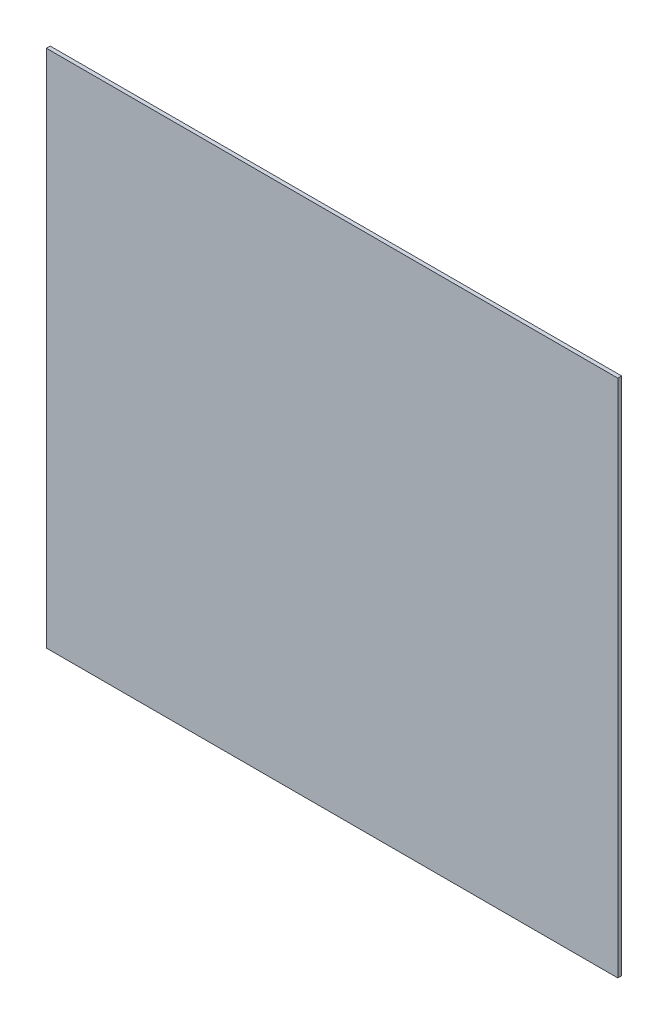
ISO-10303-21;
HEADER;
FILE_DESCRIPTION(('STEP AP214'),'2;1');
FILE_NAME('part.step','',(''),(''),'','','');
FILE_SCHEMA(('AUTOMOTIVE_DESIGN { 1 0 10303 214 1 1 1 1 }'));
ENDSEC;
DATA;
#1=APPLICATION_CONTEXT('core data for automotive mechanical design processes');
#2=APPLICATION_PROTOCOL_DEFINITION('international standard','automotive_design',2000,#1);
#3=PRODUCT_CONTEXT('',#1,'mechanical');
#4=PRODUCT('Part','Part','',(#3));
#5=PRODUCT_RELATED_PRODUCT_CATEGORY('part','',(#4));
#6=PRODUCT_DEFINITION_FORMATION('','',#4);
#7=PRODUCT_DEFINITION_CONTEXT('part definition',#1,'design');
#8=PRODUCT_DEFINITION('design','',#6,#7);
#9=PRODUCT_DEFINITION_SHAPE('','',#8);
#10=(LENGTH_UNIT() NAMED_UNIT(*) SI_UNIT(.MILLI.,.METRE.));
#11=(NAMED_UNIT(*) PLANE_ANGLE_UNIT() SI_UNIT($,.RADIAN.));
#12=(NAMED_UNIT(*) SI_UNIT($,.STERADIAN.) SOLID_ANGLE_UNIT());
#13=UNCERTAINTY_MEASURE_WITH_UNIT(LENGTH_MEASURE(1.E-05),#10,'distance_accuracy_value','');
#14=(GEOMETRIC_REPRESENTATION_CONTEXT(3) GLOBAL_UNCERTAINTY_ASSIGNED_CONTEXT((#13)) GLOBAL_UNIT_ASSIGNED_CONTEXT((#10,
#11,#12)) REPRESENTATION_CONTEXT('',''));
#15=CARTESIAN_POINT('',(0.,0.,0.));
#16=DIRECTION('',(0.,0.,1.));
#17=DIRECTION('',(1.,0.,0.));
#18=AXIS2_PLACEMENT_3D('',#15,#16,#17);
#19=CARTESIAN_POINT('',(0.,4.99999999999999,0.07366));
#20=DIRECTION('',(1.,0.,0.));
#21=DIRECTION('',(0.,1.,0.));
#22=AXIS2_PLACEMENT_3D('',#19,#20,#21);
#23=PLANE('',#22);
#24=DIRECTION('',(0.,-1.,0.));
#25=VECTOR('',#24,1.);
#26=CARTESIAN_POINT('',(0.,4.99999999999999,0.));
#27=LINE('',#26,#25);
#28=CARTESIAN_POINT('',(0.,4.99999999999999,0.));
#29=VERTEX_POINT('',#28);
#30=CARTESIAN_POINT('',(0.,-5.00000000000001,0.));
#31=VERTEX_POINT('',#30);
#32=EDGE_CURVE('E113',#29,#31,#27,.T.);
#33=ORIENTED_EDGE('',*,*,#32,.T.);
#34=DIRECTION('',(0.,0.,-1.));
#35=VECTOR('',#34,1.);
#36=CARTESIAN_POINT('',(0.,-5.00000000000001,0.07366));
#37=LINE('',#36,#35);
#38=CARTESIAN_POINT('',(0.,-5.00000000000001,0.07366));
#39=VERTEX_POINT('',#38);
#40=EDGE_CURVE('E11',#39,#31,#37,.T.);
#41=ORIENTED_EDGE('',*,*,#40,.F.);
#42=DIRECTION('',(0.,-1.,0.));
#43=VECTOR('',#42,1.);
#44=CARTESIAN_POINT('',(0.,4.99999999999999,0.07366));
#45=LINE('',#44,#43);
#46=CARTESIAN_POINT('',(0.,4.99999999999999,0.07366));
#47=VERTEX_POINT('',#46);
#48=EDGE_CURVE('E97',#47,#39,#45,.T.);
#49=ORIENTED_EDGE('',*,*,#48,.F.);
#50=DIRECTION('',(0.,0.,-1.));
#51=VECTOR('',#50,1.);
#52=CARTESIAN_POINT('',(0.,4.99999999999999,0.07366));
#53=LINE('',#52,#51);
#54=EDGE_CURVE('E109',#47,#29,#53,.T.);
#55=ORIENTED_EDGE('',*,*,#54,.T.);
#56=EDGE_LOOP('',(#33,#41,#49,#55));
#57=FACE_BOUND('',#56,.T.);
#58=ADVANCED_FACE('F45',(#57),#23,.F.);
#59=CARTESIAN_POINT('',(0.,-5.00000000000001,0.07366));
#60=DIRECTION('',(0.,1.,0.));
#61=DIRECTION('',(-1.,0.,0.));
#62=AXIS2_PLACEMENT_3D('',#59,#60,#61);
#63=PLANE('',#62);
#64=DIRECTION('',(1.,0.,0.));
#65=VECTOR('',#64,1.);
#66=CARTESIAN_POINT('',(0.,-5.00000000000001,0.));
#67=LINE('',#66,#65);
#68=CARTESIAN_POINT('',(11.,-4.99999999999999,0.));
#69=VERTEX_POINT('',#68);
#70=EDGE_CURVE('E102',#31,#69,#67,.T.);
#71=ORIENTED_EDGE('',*,*,#70,.T.);
#72=DIRECTION('',(0.,0.,-1.));
#73=VECTOR('',#72,1.);
#74=CARTESIAN_POINT('',(11.,-4.99999999999999,0.07366));
#75=LINE('',#74,#73);
#76=CARTESIAN_POINT('',(11.,-4.99999999999999,0.07366));
#77=VERTEX_POINT('',#76);
#78=EDGE_CURVE('E54',#77,#69,#75,.T.);
#79=ORIENTED_EDGE('',*,*,#78,.F.);
#80=DIRECTION('',(1.,0.,0.));
#81=VECTOR('',#80,1.);
#82=CARTESIAN_POINT('',(0.,-5.00000000000001,0.07366));
#83=LINE('',#82,#81);
#84=EDGE_CURVE('E92',#39,#77,#83,.T.);
#85=ORIENTED_EDGE('',*,*,#84,.F.);
#86=ORIENTED_EDGE('',*,*,#40,.T.);
#87=EDGE_LOOP('',(#71,#79,#85,#86));
#88=FACE_BOUND('',#87,.T.);
#89=ADVANCED_FACE('F101',(#88),#63,.F.);
#90=CARTESIAN_POINT('',(11.,5.,0.07366));
#91=DIRECTION('',(-1.,0.,0.));
#92=DIRECTION('',(0.,-1.,0.));
#93=AXIS2_PLACEMENT_3D('',#90,#91,#92);
#94=PLANE('',#93);
#95=DIRECTION('',(0.,1.,0.));
#96=VECTOR('',#95,1.);
#97=CARTESIAN_POINT('',(11.,5.,0.));
#98=LINE('',#97,#96);
#99=CARTESIAN_POINT('',(11.,5.,0.));
#100=VERTEX_POINT('',#99);
#101=EDGE_CURVE('E79',#69,#100,#98,.T.);
#102=ORIENTED_EDGE('',*,*,#101,.T.);
#103=DIRECTION('',(0.,0.,-1.));
#104=VECTOR('',#103,1.);
#105=CARTESIAN_POINT('',(11.,5.,0.07366));
#106=LINE('',#105,#104);
#107=CARTESIAN_POINT('',(11.,5.,0.07366));
#108=VERTEX_POINT('',#107);
#109=EDGE_CURVE('E104',#108,#100,#106,.T.);
#110=ORIENTED_EDGE('',*,*,#109,.F.);
#111=DIRECTION('',(0.,1.,0.));
#112=VECTOR('',#111,1.);
#113=CARTESIAN_POINT('',(11.,5.,0.07366));
#114=LINE('',#113,#112);
#115=EDGE_CURVE('E95',#77,#108,#114,.T.);
#116=ORIENTED_EDGE('',*,*,#115,.F.);
#117=ORIENTED_EDGE('',*,*,#78,.T.);
#118=EDGE_LOOP('',(#102,#110,#116,#117));
#119=FACE_BOUND('',#118,.T.);
#120=ADVANCED_FACE('F105',(#119),#94,.F.);
#121=CARTESIAN_POINT('',(0.,4.99999999999999,0.07366));
#122=DIRECTION('',(0.,-1.,0.));
#123=DIRECTION('',(1.,0.,0.));
#124=AXIS2_PLACEMENT_3D('',#121,#122,#123);
#125=PLANE('',#124);
#126=DIRECTION('',(-1.,0.,0.));
#127=VECTOR('',#126,1.);
#128=CARTESIAN_POINT('',(0.,4.99999999999999,0.));
#129=LINE('',#128,#127);
#130=EDGE_CURVE('E85',#100,#29,#129,.T.);
#131=ORIENTED_EDGE('',*,*,#130,.T.);
#132=ORIENTED_EDGE('',*,*,#54,.F.);
#133=DIRECTION('',(-1.,0.,0.));
#134=VECTOR('',#133,1.);
#135=CARTESIAN_POINT('',(0.,4.99999999999999,0.07366));
#136=LINE('',#135,#134);
#137=EDGE_CURVE('E62',#108,#47,#136,.T.);
#138=ORIENTED_EDGE('',*,*,#137,.F.);
#139=ORIENTED_EDGE('',*,*,#109,.T.);
#140=EDGE_LOOP('',(#131,#132,#138,#139));
#141=FACE_BOUND('',#140,.T.);
#142=ADVANCED_FACE('F126',(#141),#125,.F.);
#143=CARTESIAN_POINT('',(0.,0.,0.07366));
#144=DIRECTION('',(0.,0.,1.));
#145=DIRECTION('',(1.,0.,0.));
#146=AXIS2_PLACEMENT_3D('',#143,#144,#145);
#147=PLANE('',#146);
#148=ORIENTED_EDGE('',*,*,#48,.T.);
#149=ORIENTED_EDGE('',*,*,#84,.T.);
#150=ORIENTED_EDGE('',*,*,#115,.T.);
#151=ORIENTED_EDGE('',*,*,#137,.T.);
#152=EDGE_LOOP('',(#148,#149,#150,#151));
#153=FACE_BOUND('',#152,.T.);
#154=ADVANCED_FACE('F93',(#153),#147,.T.);
#155=CARTESIAN_POINT('',(0.,0.,0.));
#156=DIRECTION('',(0.,0.,1.));
#157=DIRECTION('',(1.,0.,0.));
#158=AXIS2_PLACEMENT_3D('',#155,#156,#157);
#159=PLANE('',#158);
#160=ORIENTED_EDGE('',*,*,#32,.F.);
#161=ORIENTED_EDGE('',*,*,#130,.F.);
#162=ORIENTED_EDGE('',*,*,#101,.F.);
#163=ORIENTED_EDGE('',*,*,#70,.F.);
#164=EDGE_LOOP('',(#160,#161,#162,#163));
#165=FACE_BOUND('',#164,.T.);
#166=ADVANCED_FACE('F129',(#165),#159,.F.);
#167=CLOSED_SHELL('',(#58,#89,#120,#142,#154,#166));
#168=MANIFOLD_SOLID_BREP('B2',#167);
#169=ADVANCED_BREP_SHAPE_REPRESENTATION('',(#18,#168),#14);
#170=SHAPE_DEFINITION_REPRESENTATION(#9,#169);
ENDSEC;
END-ISO-10303-21;
